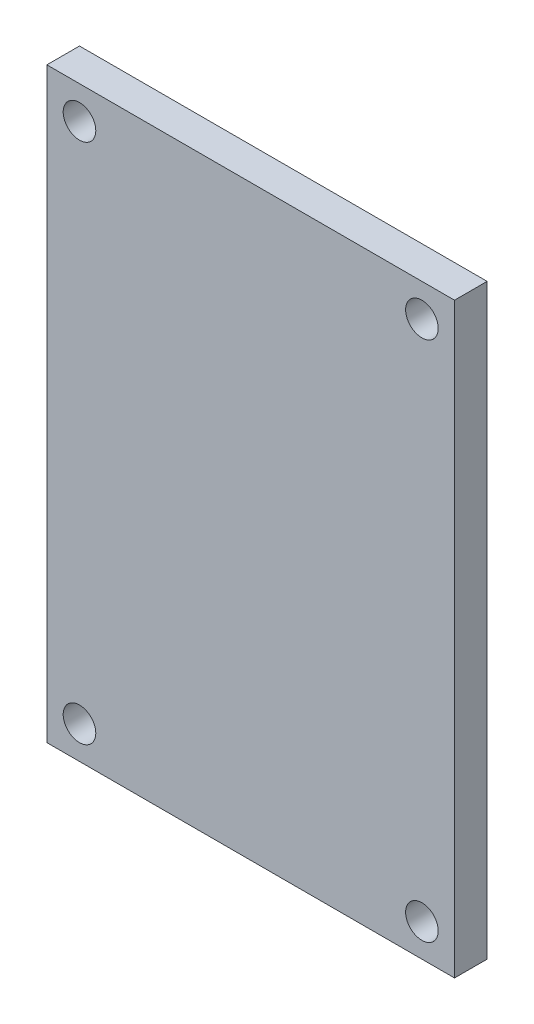
ISO-10303-21;
HEADER;
FILE_DESCRIPTION(('STEP AP214'),'2;1');
FILE_NAME('part.step','',(''),(''),'','','');
FILE_SCHEMA(('AUTOMOTIVE_DESIGN { 1 0 10303 214 1 1 1 1 }'));
ENDSEC;
DATA;
#1=APPLICATION_CONTEXT('core data for automotive mechanical design processes');
#2=APPLICATION_PROTOCOL_DEFINITION('international standard','automotive_design',2000,#1);
#3=PRODUCT_CONTEXT('',#1,'mechanical');
#4=PRODUCT('Part','Part','',(#3));
#5=PRODUCT_RELATED_PRODUCT_CATEGORY('part','',(#4));
#6=PRODUCT_DEFINITION_FORMATION('','',#4);
#7=PRODUCT_DEFINITION_CONTEXT('part definition',#1,'design');
#8=PRODUCT_DEFINITION('design','',#6,#7);
#9=PRODUCT_DEFINITION_SHAPE('','',#8);
#10=(LENGTH_UNIT() NAMED_UNIT(*) SI_UNIT(.MILLI.,.METRE.));
#11=(NAMED_UNIT(*) PLANE_ANGLE_UNIT() SI_UNIT($,.RADIAN.));
#12=(NAMED_UNIT(*) SI_UNIT($,.STERADIAN.) SOLID_ANGLE_UNIT());
#13=UNCERTAINTY_MEASURE_WITH_UNIT(LENGTH_MEASURE(1.E-05),#10,'distance_accuracy_value','');
#14=(GEOMETRIC_REPRESENTATION_CONTEXT(3) GLOBAL_UNCERTAINTY_ASSIGNED_CONTEXT((#13)) GLOBAL_UNIT_ASSIGNED_CONTEXT((#10,
#11,#12)) REPRESENTATION_CONTEXT('',''));
#15=CARTESIAN_POINT('',(0.,0.,0.));
#16=DIRECTION('',(0.,0.,1.));
#17=DIRECTION('',(1.,0.,0.));
#18=AXIS2_PLACEMENT_3D('',#15,#16,#17);
#19=CARTESIAN_POINT('',(0.,0.,2.));
#20=DIRECTION('',(0.,0.,-1.));
#21=DIRECTION('',(-1.,0.,0.));
#22=AXIS2_PLACEMENT_3D('',#19,#20,#21);
#23=PLANE('',#22);
#24=DIRECTION('',(0.,1.,0.));
#25=VECTOR('',#24,1.);
#26=CARTESIAN_POINT('',(12.5,18.,2.));
#27=LINE('',#26,#25);
#28=CARTESIAN_POINT('',(12.5,-18.,2.));
#29=VERTEX_POINT('',#28);
#30=CARTESIAN_POINT('',(12.5,18.,2.));
#31=VERTEX_POINT('',#30);
#32=EDGE_CURVE('E84',#29,#31,#27,.T.);
#33=ORIENTED_EDGE('',*,*,#32,.T.);
#34=DIRECTION('',(-1.,0.,0.));
#35=VECTOR('',#34,1.);
#36=CARTESIAN_POINT('',(12.5,18.,2.));
#37=LINE('',#36,#35);
#38=CARTESIAN_POINT('',(-12.5,18.,2.));
#39=VERTEX_POINT('',#38);
#40=EDGE_CURVE('E79',#31,#39,#37,.T.);
#41=ORIENTED_EDGE('',*,*,#40,.T.);
#42=DIRECTION('',(0.,-1.,0.));
#43=VECTOR('',#42,1.);
#44=CARTESIAN_POINT('',(-12.5,18.,2.));
#45=LINE('',#44,#43);
#46=CARTESIAN_POINT('',(-12.5,-18.,2.));
#47=VERTEX_POINT('',#46);
#48=EDGE_CURVE('E82',#39,#47,#45,.T.);
#49=ORIENTED_EDGE('',*,*,#48,.T.);
#50=DIRECTION('',(1.,0.,0.));
#51=VECTOR('',#50,1.);
#52=CARTESIAN_POINT('',(12.5,-18.,2.));
#53=LINE('',#52,#51);
#54=EDGE_CURVE('E49',#47,#29,#53,.T.);
#55=ORIENTED_EDGE('',*,*,#54,.T.);
#56=EDGE_LOOP('',(#33,#41,#49,#55));
#57=FACE_BOUND('',#56,.T.);
#58=CARTESIAN_POINT('',(-10.4999999999997,-16.,2.));
#59=DIRECTION('',(0.,0.,1.));
#60=DIRECTION('',(1.,0.,0.));
#61=AXIS2_PLACEMENT_3D('',#58,#59,#60);
#62=CIRCLE('',#61,1.);
#63=CARTESIAN_POINT('',(-9.49999999999967,-16.,2.));
#64=VERTEX_POINT('',#63);
#65=EDGE_CURVE('E99',#64,#64,#62,.T.);
#66=ORIENTED_EDGE('',*,*,#65,.F.);
#67=EDGE_LOOP('',(#66));
#68=FACE_BOUND('',#67,.T.);
#69=CARTESIAN_POINT('',(-10.5,16.,2.));
#70=DIRECTION('',(0.,0.,1.));
#71=DIRECTION('',(1.,0.,0.));
#72=AXIS2_PLACEMENT_3D('',#69,#70,#71);
#73=CIRCLE('',#72,1.);
#74=CARTESIAN_POINT('',(-9.5,16.,2.));
#75=VERTEX_POINT('',#74);
#76=EDGE_CURVE('E114',#75,#75,#73,.T.);
#77=ORIENTED_EDGE('',*,*,#76,.F.);
#78=EDGE_LOOP('',(#77));
#79=FACE_BOUND('',#78,.T.);
#80=CARTESIAN_POINT('',(10.5,16.,2.));
#81=DIRECTION('',(0.,0.,1.));
#82=DIRECTION('',(1.,0.,0.));
#83=AXIS2_PLACEMENT_3D('',#80,#81,#82);
#84=CIRCLE('',#83,1.);
#85=CARTESIAN_POINT('',(11.5,16.,2.));
#86=VERTEX_POINT('',#85);
#87=EDGE_CURVE('E120',#86,#86,#84,.T.);
#88=ORIENTED_EDGE('',*,*,#87,.F.);
#89=EDGE_LOOP('',(#88));
#90=FACE_BOUND('',#89,.T.);
#91=CARTESIAN_POINT('',(10.5000000000003,-16.,2.));
#92=DIRECTION('',(0.,0.,1.));
#93=DIRECTION('',(1.,0.,0.));
#94=AXIS2_PLACEMENT_3D('',#91,#92,#93);
#95=CIRCLE('',#94,1.);
#96=CARTESIAN_POINT('',(11.5000000000003,-16.,2.));
#97=VERTEX_POINT('',#96);
#98=EDGE_CURVE('E126',#97,#97,#95,.T.);
#99=ORIENTED_EDGE('',*,*,#98,.F.);
#100=EDGE_LOOP('',(#99));
#101=FACE_BOUND('',#100,.T.);
#102=ADVANCED_FACE('F32',(#57,#68,#79,#90,#101),#23,.F.);
#103=CARTESIAN_POINT('',(0.,0.,0.));
#104=DIRECTION('',(0.,0.,-1.));
#105=DIRECTION('',(-1.,0.,0.));
#106=AXIS2_PLACEMENT_3D('',#103,#104,#105);
#107=PLANE('',#106);
#108=CARTESIAN_POINT('',(10.5,16.,0.));
#109=DIRECTION('',(0.,0.,1.));
#110=DIRECTION('',(1.,0.,0.));
#111=AXIS2_PLACEMENT_3D('',#108,#109,#110);
#112=CIRCLE('',#111,1.);
#113=CARTESIAN_POINT('',(11.5,16.,0.));
#114=VERTEX_POINT('',#113);
#115=EDGE_CURVE('E123',#114,#114,#112,.T.);
#116=ORIENTED_EDGE('',*,*,#115,.T.);
#117=EDGE_LOOP('',(#116));
#118=FACE_BOUND('',#117,.T.);
#119=CARTESIAN_POINT('',(-10.4999999999997,-16.,0.));
#120=DIRECTION('',(0.,0.,1.));
#121=DIRECTION('',(1.,0.,0.));
#122=AXIS2_PLACEMENT_3D('',#119,#120,#121);
#123=CIRCLE('',#122,1.);
#124=CARTESIAN_POINT('',(-9.49999999999967,-16.,0.));
#125=VERTEX_POINT('',#124);
#126=EDGE_CURVE('E111',#125,#125,#123,.T.);
#127=ORIENTED_EDGE('',*,*,#126,.T.);
#128=EDGE_LOOP('',(#127));
#129=FACE_BOUND('',#128,.T.);
#130=DIRECTION('',(0.,1.,0.));
#131=VECTOR('',#130,1.);
#132=CARTESIAN_POINT('',(12.5,18.,0.));
#133=LINE('',#132,#131);
#134=CARTESIAN_POINT('',(12.5,-18.,0.));
#135=VERTEX_POINT('',#134);
#136=CARTESIAN_POINT('',(12.5,18.,0.));
#137=VERTEX_POINT('',#136);
#138=EDGE_CURVE('E96',#135,#137,#133,.T.);
#139=ORIENTED_EDGE('',*,*,#138,.F.);
#140=DIRECTION('',(1.,0.,0.));
#141=VECTOR('',#140,1.);
#142=CARTESIAN_POINT('',(12.5,-18.,0.));
#143=LINE('',#142,#141);
#144=CARTESIAN_POINT('',(-12.5,-18.,0.));
#145=VERTEX_POINT('',#144);
#146=EDGE_CURVE('E72',#145,#135,#143,.T.);
#147=ORIENTED_EDGE('',*,*,#146,.F.);
#148=DIRECTION('',(0.,-1.,0.));
#149=VECTOR('',#148,1.);
#150=CARTESIAN_POINT('',(-12.5,18.,0.));
#151=LINE('',#150,#149);
#152=CARTESIAN_POINT('',(-12.5,18.,0.));
#153=VERTEX_POINT('',#152);
#154=EDGE_CURVE('E66',#153,#145,#151,.T.);
#155=ORIENTED_EDGE('',*,*,#154,.F.);
#156=DIRECTION('',(-1.,0.,0.));
#157=VECTOR('',#156,1.);
#158=CARTESIAN_POINT('',(12.5,18.,0.));
#159=LINE('',#158,#157);
#160=EDGE_CURVE('E88',#137,#153,#159,.T.);
#161=ORIENTED_EDGE('',*,*,#160,.F.);
#162=EDGE_LOOP('',(#139,#147,#155,#161));
#163=FACE_BOUND('',#162,.T.);
#164=CARTESIAN_POINT('',(-10.5,16.,0.));
#165=DIRECTION('',(0.,0.,1.));
#166=DIRECTION('',(1.,0.,0.));
#167=AXIS2_PLACEMENT_3D('',#164,#165,#166);
#168=CIRCLE('',#167,1.);
#169=CARTESIAN_POINT('',(-9.5,16.,0.));
#170=VERTEX_POINT('',#169);
#171=EDGE_CURVE('E117',#170,#170,#168,.T.);
#172=ORIENTED_EDGE('',*,*,#171,.T.);
#173=EDGE_LOOP('',(#172));
#174=FACE_BOUND('',#173,.T.);
#175=CARTESIAN_POINT('',(10.5000000000003,-16.,0.));
#176=DIRECTION('',(0.,0.,1.));
#177=DIRECTION('',(1.,0.,0.));
#178=AXIS2_PLACEMENT_3D('',#175,#176,#177);
#179=CIRCLE('',#178,1.);
#180=CARTESIAN_POINT('',(11.5000000000003,-16.,0.));
#181=VERTEX_POINT('',#180);
#182=EDGE_CURVE('E129',#181,#181,#179,.T.);
#183=ORIENTED_EDGE('',*,*,#182,.T.);
#184=EDGE_LOOP('',(#183));
#185=FACE_BOUND('',#184,.T.);
#186=ADVANCED_FACE('F107',(#118,#129,#163,#174,#185),#107,.T.);
#187=CARTESIAN_POINT('',(12.5,18.,2.));
#188=DIRECTION('',(-1.,0.,0.));
#189=DIRECTION('',(0.,-1.,0.));
#190=AXIS2_PLACEMENT_3D('',#187,#188,#189);
#191=PLANE('',#190);
#192=ORIENTED_EDGE('',*,*,#138,.T.);
#193=DIRECTION('',(0.,0.,-1.));
#194=VECTOR('',#193,1.);
#195=CARTESIAN_POINT('',(12.5,18.,2.));
#196=LINE('',#195,#194);
#197=EDGE_CURVE('E11',#31,#137,#196,.T.);
#198=ORIENTED_EDGE('',*,*,#197,.F.);
#199=ORIENTED_EDGE('',*,*,#32,.F.);
#200=DIRECTION('',(0.,0.,-1.));
#201=VECTOR('',#200,1.);
#202=CARTESIAN_POINT('',(12.5,-18.,2.));
#203=LINE('',#202,#201);
#204=EDGE_CURVE('E92',#29,#135,#203,.T.);
#205=ORIENTED_EDGE('',*,*,#204,.T.);
#206=EDGE_LOOP('',(#192,#198,#199,#205));
#207=FACE_BOUND('',#206,.T.);
#208=ADVANCED_FACE('F34',(#207),#191,.F.);
#209=CARTESIAN_POINT('',(12.5,18.,2.));
#210=DIRECTION('',(0.,-1.,0.));
#211=DIRECTION('',(0.,0.,-1.));
#212=AXIS2_PLACEMENT_3D('',#209,#210,#211);
#213=PLANE('',#212);
#214=ORIENTED_EDGE('',*,*,#160,.T.);
#215=DIRECTION('',(0.,0.,-1.));
#216=VECTOR('',#215,1.);
#217=CARTESIAN_POINT('',(-12.5,18.,2.));
#218=LINE('',#217,#216);
#219=EDGE_CURVE('E41',#39,#153,#218,.T.);
#220=ORIENTED_EDGE('',*,*,#219,.F.);
#221=ORIENTED_EDGE('',*,*,#40,.F.);
#222=ORIENTED_EDGE('',*,*,#197,.T.);
#223=EDGE_LOOP('',(#214,#220,#221,#222));
#224=FACE_BOUND('',#223,.T.);
#225=ADVANCED_FACE('F87',(#224),#213,.F.);
#226=CARTESIAN_POINT('',(-12.5,18.,2.));
#227=DIRECTION('',(1.,0.,0.));
#228=DIRECTION('',(0.,1.,0.));
#229=AXIS2_PLACEMENT_3D('',#226,#227,#228);
#230=PLANE('',#229);
#231=ORIENTED_EDGE('',*,*,#154,.T.);
#232=DIRECTION('',(0.,0.,-1.));
#233=VECTOR('',#232,1.);
#234=CARTESIAN_POINT('',(-12.5,-18.,2.));
#235=LINE('',#234,#233);
#236=EDGE_CURVE('E89',#47,#145,#235,.T.);
#237=ORIENTED_EDGE('',*,*,#236,.F.);
#238=ORIENTED_EDGE('',*,*,#48,.F.);
#239=ORIENTED_EDGE('',*,*,#219,.T.);
#240=EDGE_LOOP('',(#231,#237,#238,#239));
#241=FACE_BOUND('',#240,.T.);
#242=ADVANCED_FACE('F90',(#241),#230,.F.);
#243=CARTESIAN_POINT('',(12.5,-18.,2.));
#244=DIRECTION('',(0.,1.,0.));
#245=DIRECTION('',(0.,0.,1.));
#246=AXIS2_PLACEMENT_3D('',#243,#244,#245);
#247=PLANE('',#246);
#248=ORIENTED_EDGE('',*,*,#146,.T.);
#249=ORIENTED_EDGE('',*,*,#204,.F.);
#250=ORIENTED_EDGE('',*,*,#54,.F.);
#251=ORIENTED_EDGE('',*,*,#236,.T.);
#252=EDGE_LOOP('',(#248,#249,#250,#251));
#253=FACE_BOUND('',#252,.T.);
#254=ADVANCED_FACE('F104',(#253),#247,.F.);
#255=CARTESIAN_POINT('',(-10.4999999999997,-16.,2.));
#256=DIRECTION('',(0.,0.,-1.));
#257=DIRECTION('',(-1.,0.,0.));
#258=AXIS2_PLACEMENT_3D('',#255,#256,#257);
#259=CYLINDRICAL_SURFACE('',#258,1.);
#260=ORIENTED_EDGE('',*,*,#65,.T.);
#261=EDGE_LOOP('',(#260));
#262=FACE_BOUND('',#261,.T.);
#263=ORIENTED_EDGE('',*,*,#126,.F.);
#264=EDGE_LOOP('',(#263));
#265=FACE_BOUND('',#264,.T.);
#266=ADVANCED_FACE('F146',(#262,#265),#259,.F.);
#267=CARTESIAN_POINT('',(-10.5,16.,2.));
#268=DIRECTION('',(0.,0.,-1.));
#269=DIRECTION('',(-1.,0.,0.));
#270=AXIS2_PLACEMENT_3D('',#267,#268,#269);
#271=CYLINDRICAL_SURFACE('',#270,1.);
#272=ORIENTED_EDGE('',*,*,#76,.T.);
#273=EDGE_LOOP('',(#272));
#274=FACE_BOUND('',#273,.T.);
#275=ORIENTED_EDGE('',*,*,#171,.F.);
#276=EDGE_LOOP('',(#275));
#277=FACE_BOUND('',#276,.T.);
#278=ADVANCED_FACE('F192',(#274,#277),#271,.F.);
#279=CARTESIAN_POINT('',(10.5,16.,2.));
#280=DIRECTION('',(0.,0.,-1.));
#281=DIRECTION('',(-1.,0.,0.));
#282=AXIS2_PLACEMENT_3D('',#279,#280,#281);
#283=CYLINDRICAL_SURFACE('',#282,1.);
#284=ORIENTED_EDGE('',*,*,#87,.T.);
#285=EDGE_LOOP('',(#284));
#286=FACE_BOUND('',#285,.T.);
#287=ORIENTED_EDGE('',*,*,#115,.F.);
#288=EDGE_LOOP('',(#287));
#289=FACE_BOUND('',#288,.T.);
#290=ADVANCED_FACE('F200',(#286,#289),#283,.F.);
#291=CARTESIAN_POINT('',(10.5000000000003,-16.,2.));
#292=DIRECTION('',(0.,0.,-1.));
#293=DIRECTION('',(-1.,0.,0.));
#294=AXIS2_PLACEMENT_3D('',#291,#292,#293);
#295=CYLINDRICAL_SURFACE('',#294,1.);
#296=ORIENTED_EDGE('',*,*,#98,.T.);
#297=EDGE_LOOP('',(#296));
#298=FACE_BOUND('',#297,.T.);
#299=ORIENTED_EDGE('',*,*,#182,.F.);
#300=EDGE_LOOP('',(#299));
#301=FACE_BOUND('',#300,.T.);
#302=ADVANCED_FACE('F135',(#298,#301),#295,.F.);
#303=CLOSED_SHELL('',(#102,#186,#208,#225,#242,#254,#266,#278,#290,#302));
#304=MANIFOLD_SOLID_BREP('B2',#303);
#305=ADVANCED_BREP_SHAPE_REPRESENTATION('',(#18,#304),#14);
#306=SHAPE_DEFINITION_REPRESENTATION(#9,#305);
ENDSEC;
END-ISO-10303-21;
